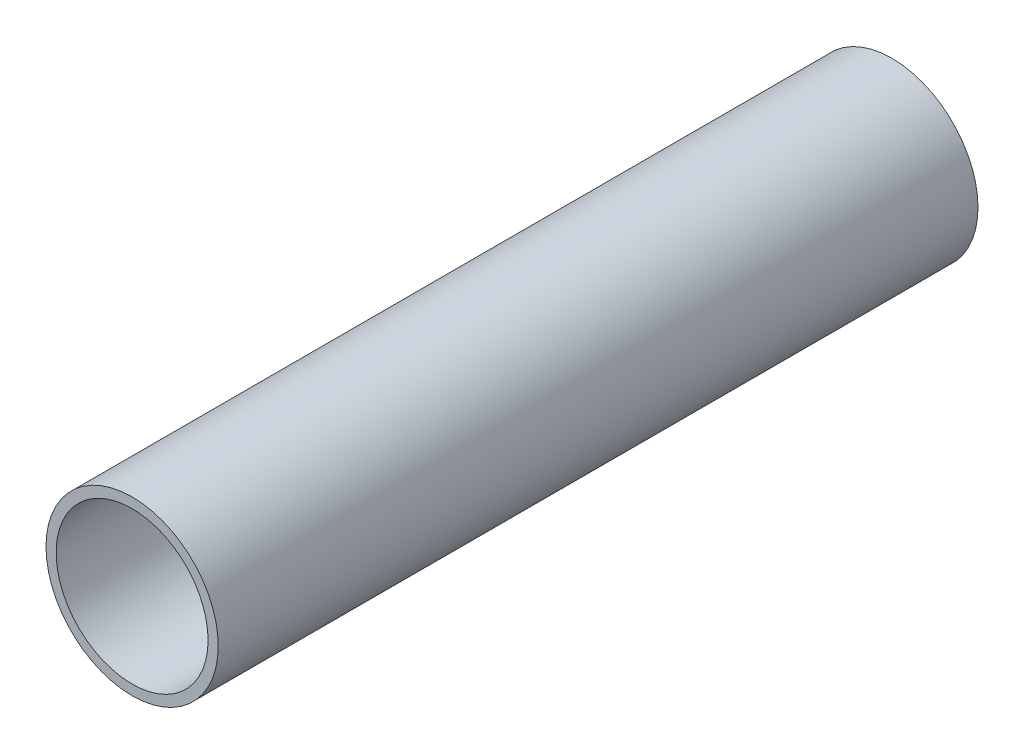
ISO-10303-21;
HEADER;
FILE_DESCRIPTION(('STEP AP214'),'2;1');
FILE_NAME('part.step','',(''),(''),'','','');
FILE_SCHEMA(('AUTOMOTIVE_DESIGN { 1 0 10303 214 1 1 1 1 }'));
ENDSEC;
DATA;
#1=APPLICATION_CONTEXT('core data for automotive mechanical design processes');
#2=APPLICATION_PROTOCOL_DEFINITION('international standard','automotive_design',2000,#1);
#3=PRODUCT_CONTEXT('',#1,'mechanical');
#4=PRODUCT('Part','Part','',(#3));
#5=PRODUCT_RELATED_PRODUCT_CATEGORY('part','',(#4));
#6=PRODUCT_DEFINITION_FORMATION('','',#4);
#7=PRODUCT_DEFINITION_CONTEXT('part definition',#1,'design');
#8=PRODUCT_DEFINITION('design','',#6,#7);
#9=PRODUCT_DEFINITION_SHAPE('','',#8);
#10=(LENGTH_UNIT() NAMED_UNIT(*) SI_UNIT(.MILLI.,.METRE.));
#11=(NAMED_UNIT(*) PLANE_ANGLE_UNIT() SI_UNIT($,.RADIAN.));
#12=(NAMED_UNIT(*) SI_UNIT($,.STERADIAN.) SOLID_ANGLE_UNIT());
#13=UNCERTAINTY_MEASURE_WITH_UNIT(LENGTH_MEASURE(1.E-05),#10,'distance_accuracy_value','');
#14=(GEOMETRIC_REPRESENTATION_CONTEXT(3) GLOBAL_UNCERTAINTY_ASSIGNED_CONTEXT((#13)) GLOBAL_UNIT_ASSIGNED_CONTEXT((#10,
#11,#12)) REPRESENTATION_CONTEXT('',''));
#15=CARTESIAN_POINT('',(0.,0.,0.));
#16=DIRECTION('',(0.,0.,1.));
#17=DIRECTION('',(1.,0.,0.));
#18=AXIS2_PLACEMENT_3D('',#15,#16,#17);
#19=CARTESIAN_POINT('',(0.,0.,75.));
#20=DIRECTION('',(0.,0.,-1.));
#21=DIRECTION('',(-1.,0.,0.));
#22=AXIS2_PLACEMENT_3D('',#19,#20,#21);
#23=CYLINDRICAL_SURFACE('',#22,15.);
#24=CARTESIAN_POINT('',(0.,0.,75.));
#25=DIRECTION('',(0.,0.,1.));
#26=DIRECTION('',(1.,0.,0.));
#27=AXIS2_PLACEMENT_3D('',#24,#25,#26);
#28=CIRCLE('',#27,15.);
#29=CARTESIAN_POINT('',(15.,0.,75.));
#30=VERTEX_POINT('',#29);
#31=EDGE_CURVE('E40',#30,#30,#28,.T.);
#32=ORIENTED_EDGE('',*,*,#31,.T.);
#33=EDGE_LOOP('',(#32));
#34=FACE_BOUND('',#33,.T.);
#35=CARTESIAN_POINT('',(0.,0.,-75.));
#36=DIRECTION('',(0.,0.,1.));
#37=DIRECTION('',(1.,0.,0.));
#38=AXIS2_PLACEMENT_3D('',#35,#36,#37);
#39=CIRCLE('',#38,15.);
#40=CARTESIAN_POINT('',(15.,0.,-75.));
#41=VERTEX_POINT('',#40);
#42=EDGE_CURVE('E46',#41,#41,#39,.T.);
#43=ORIENTED_EDGE('',*,*,#42,.F.);
#44=EDGE_LOOP('',(#43));
#45=FACE_BOUND('',#44,.T.);
#46=ADVANCED_FACE('F33',(#34,#45),#23,.F.);
#47=CARTESIAN_POINT('',(0.,0.,75.));
#48=DIRECTION('',(0.,0.,-1.));
#49=DIRECTION('',(-1.,0.,0.));
#50=AXIS2_PLACEMENT_3D('',#47,#48,#49);
#51=CYLINDRICAL_SURFACE('',#50,17.);
#52=CARTESIAN_POINT('',(0.,0.,75.));
#53=DIRECTION('',(0.,0.,1.));
#54=DIRECTION('',(1.,0.,0.));
#55=AXIS2_PLACEMENT_3D('',#52,#53,#54);
#56=CIRCLE('',#55,17.);
#57=CARTESIAN_POINT('',(17.,0.,75.));
#58=VERTEX_POINT('',#57);
#59=EDGE_CURVE('E10',#58,#58,#56,.T.);
#60=ORIENTED_EDGE('',*,*,#59,.F.);
#61=EDGE_LOOP('',(#60));
#62=FACE_BOUND('',#61,.T.);
#63=CARTESIAN_POINT('',(0.,0.,-75.));
#64=DIRECTION('',(0.,0.,1.));
#65=DIRECTION('',(1.,0.,0.));
#66=AXIS2_PLACEMENT_3D('',#63,#64,#65);
#67=CIRCLE('',#66,17.);
#68=CARTESIAN_POINT('',(17.,0.,-75.));
#69=VERTEX_POINT('',#68);
#70=EDGE_CURVE('E36',#69,#69,#67,.T.);
#71=ORIENTED_EDGE('',*,*,#70,.T.);
#72=EDGE_LOOP('',(#71));
#73=FACE_BOUND('',#72,.T.);
#74=ADVANCED_FACE('F53',(#62,#73),#51,.T.);
#75=CARTESIAN_POINT('',(0.,0.,75.));
#76=DIRECTION('',(0.,0.,1.));
#77=DIRECTION('',(1.,0.,0.));
#78=AXIS2_PLACEMENT_3D('',#75,#76,#77);
#79=PLANE('',#78);
#80=ORIENTED_EDGE('',*,*,#31,.F.);
#81=EDGE_LOOP('',(#80));
#82=FACE_BOUND('',#81,.T.);
#83=ORIENTED_EDGE('',*,*,#59,.T.);
#84=EDGE_LOOP('',(#83));
#85=FACE_BOUND('',#84,.T.);
#86=ADVANCED_FACE('F57',(#82,#85),#79,.T.);
#87=CARTESIAN_POINT('',(0.,0.,-75.));
#88=DIRECTION('',(0.,0.,1.));
#89=DIRECTION('',(1.,0.,0.));
#90=AXIS2_PLACEMENT_3D('',#87,#88,#89);
#91=PLANE('',#90);
#92=ORIENTED_EDGE('',*,*,#42,.T.);
#93=EDGE_LOOP('',(#92));
#94=FACE_BOUND('',#93,.T.);
#95=ORIENTED_EDGE('',*,*,#70,.F.);
#96=EDGE_LOOP('',(#95));
#97=FACE_BOUND('',#96,.T.);
#98=ADVANCED_FACE('F55',(#94,#97),#91,.F.);
#99=CLOSED_SHELL('',(#46,#74,#86,#98));
#100=MANIFOLD_SOLID_BREP('B2',#99);
#101=ADVANCED_BREP_SHAPE_REPRESENTATION('',(#18,#100),#14);
#102=SHAPE_DEFINITION_REPRESENTATION(#9,#101);
ENDSEC;
END-ISO-10303-21;
